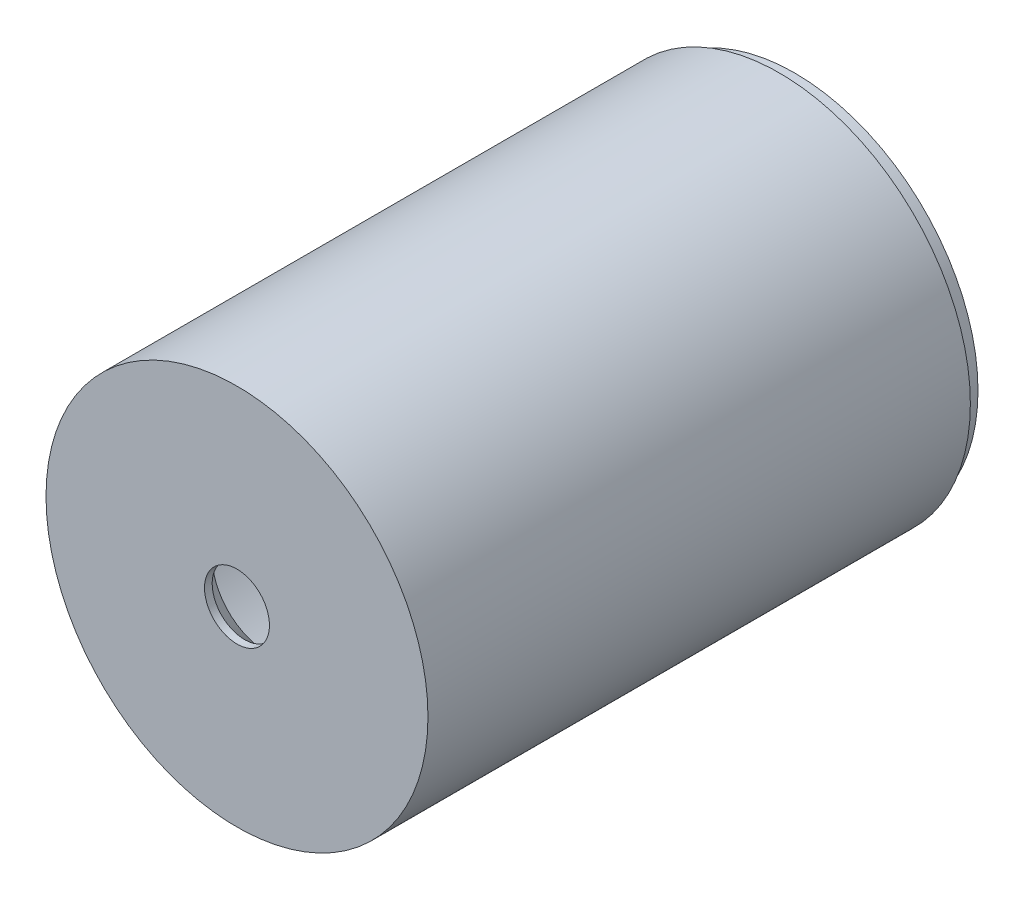
ISO-10303-21;
HEADER;
FILE_DESCRIPTION(('STEP AP214'),'2;1');
FILE_NAME('part.step','',(''),(''),'','','');
FILE_SCHEMA(('AUTOMOTIVE_DESIGN { 1 0 10303 214 1 1 1 1 }'));
ENDSEC;
DATA;
#1=APPLICATION_CONTEXT('core data for automotive mechanical design processes');
#2=APPLICATION_PROTOCOL_DEFINITION('international standard','automotive_design',2000,#1);
#3=PRODUCT_CONTEXT('',#1,'mechanical');
#4=PRODUCT('Part','Part','',(#3));
#5=PRODUCT_RELATED_PRODUCT_CATEGORY('part','',(#4));
#6=PRODUCT_DEFINITION_FORMATION('','',#4);
#7=PRODUCT_DEFINITION_CONTEXT('part definition',#1,'design');
#8=PRODUCT_DEFINITION('design','',#6,#7);
#9=PRODUCT_DEFINITION_SHAPE('','',#8);
#10=(LENGTH_UNIT() NAMED_UNIT(*) SI_UNIT(.MILLI.,.METRE.));
#11=(NAMED_UNIT(*) PLANE_ANGLE_UNIT() SI_UNIT($,.RADIAN.));
#12=(NAMED_UNIT(*) SI_UNIT($,.STERADIAN.) SOLID_ANGLE_UNIT());
#13=UNCERTAINTY_MEASURE_WITH_UNIT(LENGTH_MEASURE(1.E-05),#10,'distance_accuracy_value','');
#14=(GEOMETRIC_REPRESENTATION_CONTEXT(3) GLOBAL_UNCERTAINTY_ASSIGNED_CONTEXT((#13)) GLOBAL_UNIT_ASSIGNED_CONTEXT((#10,
#11,#12)) REPRESENTATION_CONTEXT('',''));
#15=CARTESIAN_POINT('',(0.,0.,0.));
#16=DIRECTION('',(0.,0.,1.));
#17=DIRECTION('',(1.,0.,0.));
#18=AXIS2_PLACEMENT_3D('',#15,#16,#17);
#19=CARTESIAN_POINT('',(0.,0.,0.));
#20=DIRECTION('',(0.,0.,1.));
#21=DIRECTION('',(1.,0.,0.));
#22=AXIS2_PLACEMENT_3D('',#19,#20,#21);
#23=PLANE('',#22);
#24=CARTESIAN_POINT('',(0.,0.,0.));
#25=DIRECTION('',(0.,0.,1.));
#26=DIRECTION('',(1.,0.,0.));
#27=AXIS2_PLACEMENT_3D('',#24,#25,#26);
#28=CIRCLE('',#27,2.3);
#29=CARTESIAN_POINT('',(2.3,0.,0.));
#30=VERTEX_POINT('',#29);
#31=EDGE_CURVE('E57',#30,#30,#28,.T.);
#32=ORIENTED_EDGE('',*,*,#31,.T.);
#33=EDGE_LOOP('',(#32));
#34=FACE_BOUND('',#33,.T.);
#35=CARTESIAN_POINT('',(0.,0.,0.));
#36=DIRECTION('',(0.,0.,-1.));
#37=DIRECTION('',(-1.,0.,0.));
#38=AXIS2_PLACEMENT_3D('',#35,#36,#37);
#39=CIRCLE('',#38,2.4);
#40=CARTESIAN_POINT('',(-2.4,0.,0.));
#41=VERTEX_POINT('',#40);
#42=EDGE_CURVE('E79',#41,#41,#39,.T.);
#43=ORIENTED_EDGE('',*,*,#42,.T.);
#44=EDGE_LOOP('',(#43));
#45=FACE_BOUND('',#44,.T.);
#46=ADVANCED_FACE('F36',(#34,#45),#23,.F.);
#47=CARTESIAN_POINT('',(0.,0.,6.3));
#48=DIRECTION('',(0.,0.,-1.));
#49=DIRECTION('',(-1.,0.,0.));
#50=AXIS2_PLACEMENT_3D('',#47,#48,#49);
#51=CYLINDRICAL_SURFACE('',#50,2.5);
#52=CARTESIAN_POINT('',(0.,0.,7.3));
#53=DIRECTION('',(0.,0.,1.));
#54=DIRECTION('',(1.,0.,0.));
#55=AXIS2_PLACEMENT_3D('',#52,#53,#54);
#56=CIRCLE('',#55,2.5);
#57=CARTESIAN_POINT('',(2.5,0.,7.3));
#58=VERTEX_POINT('',#57);
#59=EDGE_CURVE('E63',#58,#58,#56,.T.);
#60=ORIENTED_EDGE('',*,*,#59,.F.);
#61=EDGE_LOOP('',(#60));
#62=FACE_BOUND('',#61,.T.);
#63=CARTESIAN_POINT('',(0.,0.,0.2));
#64=DIRECTION('',(0.,0.,-1.));
#65=DIRECTION('',(-1.,0.,0.));
#66=AXIS2_PLACEMENT_3D('',#63,#64,#65);
#67=CIRCLE('',#66,2.5);
#68=CARTESIAN_POINT('',(-2.5,0.,0.2));
#69=VERTEX_POINT('',#68);
#70=EDGE_CURVE('E75',#69,#69,#67,.T.);
#71=ORIENTED_EDGE('',*,*,#70,.F.);
#72=EDGE_LOOP('',(#71));
#73=FACE_BOUND('',#72,.T.);
#74=ADVANCED_FACE('F94',(#62,#73),#51,.T.);
#75=CARTESIAN_POINT('',(0.,0.,7.3));
#76=DIRECTION('',(0.,0.,-1.));
#77=DIRECTION('',(-1.,0.,0.));
#78=AXIS2_PLACEMENT_3D('',#75,#76,#77);
#79=CYLINDRICAL_SURFACE('',#78,0.425);
#80=CARTESIAN_POINT('',(0.,0.,7.2));
#81=DIRECTION('',(0.,0.,-1.));
#82=DIRECTION('',(-1.,0.,0.));
#83=AXIS2_PLACEMENT_3D('',#80,#81,#82);
#84=CIRCLE('',#83,0.425);
#85=CARTESIAN_POINT('',(-0.425,0.,7.2));
#86=VERTEX_POINT('',#85);
#87=EDGE_CURVE('E10',#86,#86,#84,.T.);
#88=ORIENTED_EDGE('',*,*,#87,.T.);
#89=EDGE_LOOP('',(#88));
#90=FACE_BOUND('',#89,.T.);
#91=CARTESIAN_POINT('',(0.,0.,7.3));
#92=DIRECTION('',(0.,0.,-1.));
#93=DIRECTION('',(-1.,0.,0.));
#94=AXIS2_PLACEMENT_3D('',#91,#92,#93);
#95=CIRCLE('',#94,0.425);
#96=CARTESIAN_POINT('',(-0.425,0.,7.3));
#97=VERTEX_POINT('',#96);
#98=EDGE_CURVE('E66',#97,#97,#95,.T.);
#99=ORIENTED_EDGE('',*,*,#98,.F.);
#100=EDGE_LOOP('',(#99));
#101=FACE_BOUND('',#100,.T.);
#102=ADVANCED_FACE('F96',(#90,#101),#79,.F.);
#103=CARTESIAN_POINT('',(0.,0.,6.3));
#104=DIRECTION('',(0.,0.,-1.));
#105=DIRECTION('',(-1.,0.,0.));
#106=AXIS2_PLACEMENT_3D('',#103,#104,#105);
#107=CYLINDRICAL_SURFACE('',#106,2.3);
#108=CARTESIAN_POINT('',(0.,0.,6.3));
#109=DIRECTION('',(0.,0.,1.));
#110=DIRECTION('',(1.,0.,0.));
#111=AXIS2_PLACEMENT_3D('',#108,#109,#110);
#112=CIRCLE('',#111,2.3);
#113=CARTESIAN_POINT('',(2.3,0.,6.3));
#114=VERTEX_POINT('',#113);
#115=EDGE_CURVE('E60',#114,#114,#112,.T.);
#116=ORIENTED_EDGE('',*,*,#115,.T.);
#117=EDGE_LOOP('',(#116));
#118=FACE_BOUND('',#117,.T.);
#119=ORIENTED_EDGE('',*,*,#31,.F.);
#120=EDGE_LOOP('',(#119));
#121=FACE_BOUND('',#120,.T.);
#122=ADVANCED_FACE('F103',(#118,#121),#107,.F.);
#123=CARTESIAN_POINT('',(0.,0.,7.3));
#124=DIRECTION('',(0.,0.,1.));
#125=DIRECTION('',(1.,0.,0.));
#126=AXIS2_PLACEMENT_3D('',#123,#124,#125);
#127=PLANE('',#126);
#128=ORIENTED_EDGE('',*,*,#98,.T.);
#129=EDGE_LOOP('',(#128));
#130=FACE_BOUND('',#129,.T.);
#131=ORIENTED_EDGE('',*,*,#59,.T.);
#132=EDGE_LOOP('',(#131));
#133=FACE_BOUND('',#132,.T.);
#134=ADVANCED_FACE('F139',(#130,#133),#127,.T.);
#135=CARTESIAN_POINT('',(0.,0.,6.9));
#136=DIRECTION('',(0.,0.,-1.));
#137=DIRECTION('',(-1.,0.,0.));
#138=AXIS2_PLACEMENT_3D('',#135,#136,#137);
#139=PLANE('',#138);
#140=CARTESIAN_POINT('',(0.,0.,6.9));
#141=DIRECTION('',(0.,0.,-1.));
#142=DIRECTION('',(-1.,0.,0.));
#143=AXIS2_PLACEMENT_3D('',#140,#141,#142);
#144=CIRCLE('',#143,0.725000000000002);
#145=CARTESIAN_POINT('',(-0.725000000000002,0.,6.9));
#146=VERTEX_POINT('',#145);
#147=EDGE_CURVE('E44',#146,#146,#144,.F.);
#148=ORIENTED_EDGE('',*,*,#147,.T.);
#149=EDGE_LOOP('',(#148));
#150=FACE_BOUND('',#149,.T.);
#151=CARTESIAN_POINT('',(0.,0.,6.9));
#152=DIRECTION('',(0.,0.,-1.));
#153=DIRECTION('',(-1.,0.,0.));
#154=AXIS2_PLACEMENT_3D('',#151,#152,#153);
#155=CIRCLE('',#154,1.675);
#156=CARTESIAN_POINT('',(-1.675,0.,6.9));
#157=VERTEX_POINT('',#156);
#158=EDGE_CURVE('E69',#157,#157,#155,.T.);
#159=ORIENTED_EDGE('',*,*,#158,.T.);
#160=EDGE_LOOP('',(#159));
#161=FACE_BOUND('',#160,.T.);
#162=ADVANCED_FACE('F128',(#150,#161),#139,.T.);
#163=CARTESIAN_POINT('',(0.,0.,6.8));
#164=DIRECTION('',(0.,0.,-1.));
#165=DIRECTION('',(-1.,0.,0.));
#166=AXIS2_PLACEMENT_3D('',#163,#164,#165);
#167=PLANE('',#166);
#168=CARTESIAN_POINT('',(0.,0.,6.8));
#169=DIRECTION('',(0.,0.,-1.));
#170=DIRECTION('',(-1.,0.,0.));
#171=AXIS2_PLACEMENT_3D('',#168,#169,#170);
#172=CIRCLE('',#171,1.775);
#173=CARTESIAN_POINT('',(-1.775,0.,6.8));
#174=VERTEX_POINT('',#173);
#175=EDGE_CURVE('E48',#174,#174,#172,.F.);
#176=ORIENTED_EDGE('',*,*,#175,.T.);
#177=EDGE_LOOP('',(#176));
#178=FACE_BOUND('',#177,.T.);
#179=CARTESIAN_POINT('',(0.,0.,6.8));
#180=DIRECTION('',(0.,0.,-1.));
#181=DIRECTION('',(-1.,0.,0.));
#182=AXIS2_PLACEMENT_3D('',#179,#180,#181);
#183=CIRCLE('',#182,2.2);
#184=CARTESIAN_POINT('',(-2.2,0.,6.8));
#185=VERTEX_POINT('',#184);
#186=EDGE_CURVE('E72',#185,#185,#183,.T.);
#187=ORIENTED_EDGE('',*,*,#186,.T.);
#188=EDGE_LOOP('',(#187));
#189=FACE_BOUND('',#188,.T.);
#190=ADVANCED_FACE('F125',(#178,#189),#167,.T.);
#191=CARTESIAN_POINT('',(0.,0.,6.8));
#192=DIRECTION('',(0.,0.,-1.));
#193=DIRECTION('',(-1.,0.,0.));
#194=AXIS2_PLACEMENT_3D('',#191,#192,#193);
#195=CYLINDRICAL_SURFACE('',#194,2.2);
#196=CARTESIAN_POINT('',(0.,0.,6.4));
#197=DIRECTION('',(0.,0.,1.));
#198=DIRECTION('',(1.,0.,0.));
#199=AXIS2_PLACEMENT_3D('',#196,#197,#198);
#200=CIRCLE('',#199,2.2);
#201=CARTESIAN_POINT('',(2.2,0.,6.4));
#202=VERTEX_POINT('',#201);
#203=EDGE_CURVE('E52',#202,#202,#200,.F.);
#204=ORIENTED_EDGE('',*,*,#203,.T.);
#205=EDGE_LOOP('',(#204));
#206=FACE_BOUND('',#205,.T.);
#207=ORIENTED_EDGE('',*,*,#186,.F.);
#208=EDGE_LOOP('',(#207));
#209=FACE_BOUND('',#208,.T.);
#210=ADVANCED_FACE('F113',(#206,#209),#195,.F.);
#211=CARTESIAN_POINT('',(0.,0.,6.4));
#212=DIRECTION('',(0.,0.,1.));
#213=DIRECTION('',(1.,0.,0.));
#214=AXIS2_PLACEMENT_3D('',#211,#212,#213);
#215=TOROIDAL_SURFACE('',#214,2.3,0.1);
#216=ORIENTED_EDGE('',*,*,#115,.F.);
#217=EDGE_LOOP('',(#216));
#218=FACE_BOUND('',#217,.T.);
#219=ORIENTED_EDGE('',*,*,#203,.F.);
#220=EDGE_LOOP('',(#219));
#221=FACE_BOUND('',#220,.T.);
#222=ADVANCED_FACE('F110',(#218,#221),#215,.T.);
#223=CARTESIAN_POINT('',(0.,0.,6.9));
#224=DIRECTION('',(0.,0.,-1.));
#225=DIRECTION('',(-1.,0.,0.));
#226=AXIS2_PLACEMENT_3D('',#223,#224,#225);
#227=TOROIDAL_SURFACE('',#226,1.775,0.1);
#228=ORIENTED_EDGE('',*,*,#158,.F.);
#229=EDGE_LOOP('',(#228));
#230=FACE_BOUND('',#229,.T.);
#231=ORIENTED_EDGE('',*,*,#175,.F.);
#232=EDGE_LOOP('',(#231));
#233=FACE_BOUND('',#232,.T.);
#234=ADVANCED_FACE('F112',(#230,#233),#227,.T.);
#235=CARTESIAN_POINT('',(0.,0.,6.9));
#236=DIRECTION('',(0.,0.,-1.));
#237=DIRECTION('',(-1.,0.,0.));
#238=AXIS2_PLACEMENT_3D('',#235,#236,#237);
#239=CONICAL_SURFACE('',#238,0.725000000000002,0.785398163397448);
#240=ORIENTED_EDGE('',*,*,#87,.F.);
#241=EDGE_LOOP('',(#240));
#242=FACE_BOUND('',#241,.T.);
#243=ORIENTED_EDGE('',*,*,#147,.F.);
#244=EDGE_LOOP('',(#243));
#245=FACE_BOUND('',#244,.T.);
#246=ADVANCED_FACE('F39',(#242,#245),#239,.F.);
#247=CARTESIAN_POINT('',(0.,0.,0.2));
#248=DIRECTION('',(0.,0.,-1.));
#249=DIRECTION('',(-1.,0.,0.));
#250=AXIS2_PLACEMENT_3D('',#247,#248,#249);
#251=PLANE('',#250);
#252=CARTESIAN_POINT('',(0.,0.,0.2));
#253=DIRECTION('',(0.,0.,-1.));
#254=DIRECTION('',(-1.,0.,0.));
#255=AXIS2_PLACEMENT_3D('',#252,#253,#254);
#256=CIRCLE('',#255,2.4);
#257=CARTESIAN_POINT('',(-2.4,0.,0.2));
#258=VERTEX_POINT('',#257);
#259=EDGE_CURVE('E78',#258,#258,#256,.T.);
#260=ORIENTED_EDGE('',*,*,#259,.F.);
#261=EDGE_LOOP('',(#260));
#262=FACE_BOUND('',#261,.T.);
#263=ORIENTED_EDGE('',*,*,#70,.T.);
#264=EDGE_LOOP('',(#263));
#265=FACE_BOUND('',#264,.T.);
#266=ADVANCED_FACE('F88',(#262,#265),#251,.T.);
#267=CARTESIAN_POINT('',(0.,0.,0.2));
#268=DIRECTION('',(0.,0.,-1.));
#269=DIRECTION('',(-1.,0.,0.));
#270=AXIS2_PLACEMENT_3D('',#267,#268,#269);
#271=CYLINDRICAL_SURFACE('',#270,2.4);
#272=ORIENTED_EDGE('',*,*,#259,.T.);
#273=EDGE_LOOP('',(#272));
#274=FACE_BOUND('',#273,.T.);
#275=ORIENTED_EDGE('',*,*,#42,.F.);
#276=EDGE_LOOP('',(#275));
#277=FACE_BOUND('',#276,.T.);
#278=ADVANCED_FACE('F85',(#274,#277),#271,.T.);
#279=CLOSED_SHELL('',(#46,#74,#102,#122,#134,#162,#190,#210,#222,#234,#246,#266,#278));
#280=MANIFOLD_SOLID_BREP('B2',#279);
#281=ADVANCED_BREP_SHAPE_REPRESENTATION('',(#18,#280),#14);
#282=SHAPE_DEFINITION_REPRESENTATION(#9,#281);
ENDSEC;
END-ISO-10303-21;
